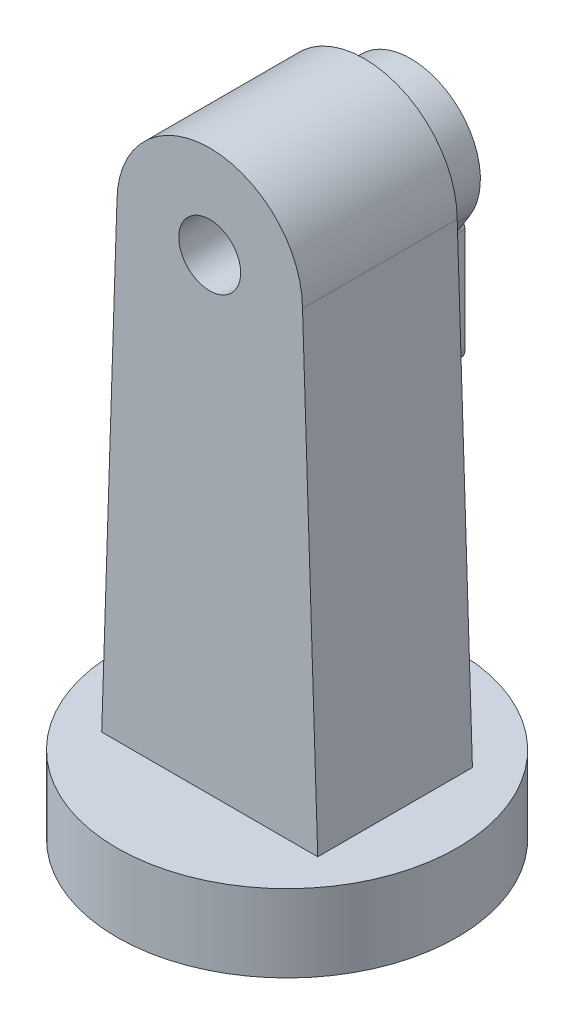
ISO-10303-21;
HEADER;
FILE_DESCRIPTION(('STEP AP214'),'2;1');
FILE_NAME('part.step','',(''),(''),'','','');
FILE_SCHEMA(('AUTOMOTIVE_DESIGN { 1 0 10303 214 1 1 1 1 }'));
ENDSEC;
DATA;
#1=APPLICATION_CONTEXT('core data for automotive mechanical design processes');
#2=APPLICATION_PROTOCOL_DEFINITION('international standard','automotive_design',2000,#1);
#3=PRODUCT_CONTEXT('',#1,'mechanical');
#4=PRODUCT('Part','Part','',(#3));
#5=PRODUCT_RELATED_PRODUCT_CATEGORY('part','',(#4));
#6=PRODUCT_DEFINITION_FORMATION('','',#4);
#7=PRODUCT_DEFINITION_CONTEXT('part definition',#1,'design');
#8=PRODUCT_DEFINITION('design','',#6,#7);
#9=PRODUCT_DEFINITION_SHAPE('','',#8);
#10=(LENGTH_UNIT() NAMED_UNIT(*) SI_UNIT(.MILLI.,.METRE.));
#11=(NAMED_UNIT(*) PLANE_ANGLE_UNIT() SI_UNIT($,.RADIAN.));
#12=(NAMED_UNIT(*) SI_UNIT($,.STERADIAN.) SOLID_ANGLE_UNIT());
#13=UNCERTAINTY_MEASURE_WITH_UNIT(LENGTH_MEASURE(1.E-05),#10,'distance_accuracy_value','');
#14=(GEOMETRIC_REPRESENTATION_CONTEXT(3) GLOBAL_UNCERTAINTY_ASSIGNED_CONTEXT((#13)) GLOBAL_UNIT_ASSIGNED_CONTEXT((#10,
#11,#12)) REPRESENTATION_CONTEXT('',''));
#15=CARTESIAN_POINT('',(0.,0.,0.));
#16=DIRECTION('',(0.,0.,1.));
#17=DIRECTION('',(1.,0.,0.));
#18=AXIS2_PLACEMENT_3D('',#15,#16,#17);
#19=CARTESIAN_POINT('',(0.,352.,-50.));
#20=DIRECTION('',(0.,0.,1.));
#21=DIRECTION('',(1.,0.,0.));
#22=AXIS2_PLACEMENT_3D('',#19,#20,#21);
#23=PLANE('',#22);
#24=CARTESIAN_POINT('',(-90.,200.,-50.));
#25=DIRECTION('',(0.,0.,-1.));
#26=DIRECTION('',(-1.,0.,0.));
#27=AXIS2_PLACEMENT_3D('',#24,#25,#26);
#28=CIRCLE('',#27,40.);
#29=CARTESIAN_POINT('',(-56.1716242251202,178.654251185926,-50.));
#30=VERTEX_POINT('',#29);
#31=CARTESIAN_POINT('',(-65.9933221673163,168.005009463391,-50.));
#32=VERTEX_POINT('',#31);
#33=EDGE_CURVE('E250',#30,#32,#28,.T.);
#34=ORIENTED_EDGE('',*,*,#33,.F.);
#35=DIRECTION('',(-0.53364372035184,-0.845709394371996,0.));
#36=VECTOR('',#35,1.);
#37=CARTESIAN_POINT('',(38.0569227467398,327.986032584167,-50.));
#38=LINE('',#37,#36);
#39=CARTESIAN_POINT('',(38.0569227467398,327.986032584167,-50.));
#40=VERTEX_POINT('',#39);
#41=EDGE_CURVE('E216',#40,#30,#38,.T.);
#42=ORIENTED_EDGE('',*,*,#41,.F.);
#43=CARTESIAN_POINT('',(0.,352.,-50.));
#44=DIRECTION('',(0.,0.,-1.));
#45=DIRECTION('',(-1.,0.,0.));
#46=AXIS2_PLACEMENT_3D('',#43,#44,#45);
#47=CIRCLE('',#46,45.);
#48=CARTESIAN_POINT('',(-39.3548332710316,373.821940752584,-50.));
#49=VERTEX_POINT('',#48);
#50=EDGE_CURVE('E209',#49,#40,#47,.T.);
#51=ORIENTED_EDGE('',*,*,#50,.F.);
#52=DIRECTION('',(0.4849320167241,0.874551850467368,0.));
#53=VECTOR('',#52,1.);
#54=CARTESIAN_POINT('',(-124.982074018695,219.397280668964,-50.));
#55=LINE('',#54,#53);
#56=CARTESIAN_POINT('',(-60.5333037268024,335.627575587166,-50.));
#57=VERTEX_POINT('',#56);
#58=EDGE_CURVE('E253',#57,#49,#55,.T.);
#59=ORIENTED_EDGE('',*,*,#58,.F.);
#60=DIRECTION('',(-0.0325560231980527,-0.999469912180216,0.));
#61=VECTOR('',#60,1.);
#62=CARTESIAN_POINT('',(-60.,352.,-50.));
#63=LINE('',#62,#61);
#64=CARTESIAN_POINT('',(-60.,352.,-50.));
#65=VERTEX_POINT('',#64);
#66=EDGE_CURVE('E290',#65,#57,#63,.T.);
#67=ORIENTED_EDGE('',*,*,#66,.F.);
#68=CARTESIAN_POINT('',(0.,352.,-50.));
#69=DIRECTION('',(0.,0.,1.));
#70=DIRECTION('',(1.,0.,0.));
#71=AXIS2_PLACEMENT_3D('',#68,#69,#70);
#72=CIRCLE('',#71,60.);
#73=CARTESIAN_POINT('',(60.,352.,-50.));
#74=VERTEX_POINT('',#73);
#75=EDGE_CURVE('E278',#74,#65,#72,.T.);
#76=ORIENTED_EDGE('',*,*,#75,.F.);
#77=DIRECTION('',(-0.0325560231980527,0.999469912180216,0.));
#78=VECTOR('',#77,1.);
#79=CARTESIAN_POINT('',(70.,45.,-50.));
#80=LINE('',#79,#78);
#81=CARTESIAN_POINT('',(69.8371335504886,50.,-50.));
#82=VERTEX_POINT('',#81);
#83=EDGE_CURVE('E292',#82,#74,#80,.T.);
#84=ORIENTED_EDGE('',*,*,#83,.F.);
#85=DIRECTION('',(1.,0.,0.));
#86=VECTOR('',#85,1.);
#87=CARTESIAN_POINT('',(0.,50.,-50.));
#88=LINE('',#87,#86);
#89=CARTESIAN_POINT('',(-69.8371335504886,50.,-50.));
#90=VERTEX_POINT('',#89);
#91=EDGE_CURVE('E310',#90,#82,#88,.T.);
#92=ORIENTED_EDGE('',*,*,#91,.F.);
#93=EDGE_CURVE('E295',#32,#90,#63,.T.);
#94=ORIENTED_EDGE('',*,*,#93,.F.);
#95=EDGE_LOOP('',(#34,#42,#51,#59,#67,#76,#84,#92,#94));
#96=FACE_BOUND('',#95,.T.);
#97=ADVANCED_FACE('F47',(#96),#23,.F.);
#98=CARTESIAN_POINT('',(0.,50.,0.));
#99=DIRECTION('',(0.,-1.,0.));
#100=DIRECTION('',(0.,0.,-1.));
#101=AXIS2_PLACEMENT_3D('',#98,#99,#100);
#102=CYLINDRICAL_SURFACE('',#101,110.);
#103=CARTESIAN_POINT('',(0.,50.,0.));
#104=DIRECTION('',(0.,1.,0.));
#105=DIRECTION('',(0.,0.,1.));
#106=AXIS2_PLACEMENT_3D('',#103,#104,#105);
#107=CIRCLE('',#106,110.);
#108=CARTESIAN_POINT('',(0.,50.,110.));
#109=VERTEX_POINT('',#108);
#110=EDGE_CURVE('E303',#109,#109,#107,.T.);
#111=ORIENTED_EDGE('',*,*,#110,.F.);
#112=EDGE_LOOP('',(#111));
#113=FACE_BOUND('',#112,.T.);
#114=CARTESIAN_POINT('',(0.,0.,0.));
#115=DIRECTION('',(0.,1.,0.));
#116=DIRECTION('',(0.,0.,1.));
#117=AXIS2_PLACEMENT_3D('',#114,#115,#116);
#118=CIRCLE('',#117,110.);
#119=CARTESIAN_POINT('',(0.,0.,110.));
#120=VERTEX_POINT('',#119);
#121=EDGE_CURVE('E301',#120,#120,#118,.T.);
#122=ORIENTED_EDGE('',*,*,#121,.T.);
#123=EDGE_LOOP('',(#122));
#124=FACE_BOUND('',#123,.T.);
#125=ADVANCED_FACE('F51',(#113,#124),#102,.T.);
#126=CARTESIAN_POINT('',(0.,50.,0.));
#127=DIRECTION('',(0.,1.,0.));
#128=DIRECTION('',(0.,0.,1.));
#129=AXIS2_PLACEMENT_3D('',#126,#127,#128);
#130=PLANE('',#129);
#131=DIRECTION('',(1.,0.,0.));
#132=VECTOR('',#131,1.);
#133=CARTESIAN_POINT('',(0.,50.,50.));
#134=LINE('',#133,#132);
#135=CARTESIAN_POINT('',(-69.8371335504886,50.,50.));
#136=VERTEX_POINT('',#135);
#137=CARTESIAN_POINT('',(69.8371335504886,50.,50.));
#138=VERTEX_POINT('',#137);
#139=EDGE_CURVE('E56',#136,#138,#134,.T.);
#140=ORIENTED_EDGE('',*,*,#139,.F.);
#141=DIRECTION('',(0.,0.,-1.));
#142=VECTOR('',#141,1.);
#143=CARTESIAN_POINT('',(-69.8371335504886,50.,0.));
#144=LINE('',#143,#142);
#145=EDGE_CURVE('E319',#136,#90,#144,.T.);
#146=ORIENTED_EDGE('',*,*,#145,.T.);
#147=ORIENTED_EDGE('',*,*,#91,.T.);
#148=DIRECTION('',(0.,0.,1.));
#149=VECTOR('',#148,1.);
#150=CARTESIAN_POINT('',(69.8371335504886,50.,0.));
#151=LINE('',#150,#149);
#152=EDGE_CURVE('E316',#82,#138,#151,.T.);
#153=ORIENTED_EDGE('',*,*,#152,.T.);
#154=EDGE_LOOP('',(#140,#146,#147,#153));
#155=FACE_BOUND('',#154,.T.);
#156=ORIENTED_EDGE('',*,*,#110,.T.);
#157=EDGE_LOOP('',(#156));
#158=FACE_BOUND('',#157,.T.);
#159=ADVANCED_FACE('F338',(#155,#158),#130,.T.);
#160=CARTESIAN_POINT('',(0.,0.,0.));
#161=DIRECTION('',(0.,1.,0.));
#162=DIRECTION('',(0.,0.,1.));
#163=AXIS2_PLACEMENT_3D('',#160,#161,#162);
#164=PLANE('',#163);
#165=ORIENTED_EDGE('',*,*,#121,.F.);
#166=EDGE_LOOP('',(#165));
#167=FACE_BOUND('',#166,.T.);
#168=ADVANCED_FACE('F431',(#167),#164,.F.);
#169=CARTESIAN_POINT('',(-60.,352.,50.));
#170=DIRECTION('',(0.999469912180216,-0.0325560231980527,0.));
#171=DIRECTION('',(0.0325560231980527,0.999469912180216,0.));
#172=AXIS2_PLACEMENT_3D('',#169,#170,#171);
#173=PLANE('',#172);
#174=ORIENTED_EDGE('',*,*,#145,.F.);
#175=DIRECTION('',(-0.0325560231980527,-0.999469912180216,0.));
#176=VECTOR('',#175,1.);
#177=CARTESIAN_POINT('',(-60.,352.,50.));
#178=LINE('',#177,#176);
#179=CARTESIAN_POINT('',(-60.,352.,50.));
#180=VERTEX_POINT('',#179);
#181=EDGE_CURVE('E274',#180,#136,#178,.T.);
#182=ORIENTED_EDGE('',*,*,#181,.F.);
#183=DIRECTION('',(0.,0.,-1.));
#184=VECTOR('',#183,1.);
#185=CARTESIAN_POINT('',(-60.,352.,50.));
#186=LINE('',#185,#184);
#187=EDGE_CURVE('E287',#180,#65,#186,.T.);
#188=ORIENTED_EDGE('',*,*,#187,.T.);
#189=ORIENTED_EDGE('',*,*,#66,.T.);
#190=EDGE_CURVE('E269',#57,#32,#63,.T.);
#191=ORIENTED_EDGE('',*,*,#190,.T.);
#192=ORIENTED_EDGE('',*,*,#93,.T.);
#193=EDGE_LOOP('',(#174,#182,#188,#189,#191,#192));
#194=FACE_BOUND('',#193,.T.);
#195=ADVANCED_FACE('F350',(#194),#173,.F.);
#196=CARTESIAN_POINT('',(70.,45.,50.));
#197=DIRECTION('',(-0.999469912180216,-0.0325560231980527,0.));
#198=DIRECTION('',(0.0325560231980527,-0.999469912180216,0.));
#199=AXIS2_PLACEMENT_3D('',#196,#197,#198);
#200=PLANE('',#199);
#201=ORIENTED_EDGE('',*,*,#152,.F.);
#202=ORIENTED_EDGE('',*,*,#83,.T.);
#203=DIRECTION('',(0.,0.,-1.));
#204=VECTOR('',#203,1.);
#205=CARTESIAN_POINT('',(60.,352.,50.));
#206=LINE('',#205,#204);
#207=CARTESIAN_POINT('',(60.,352.,50.));
#208=VERTEX_POINT('',#207);
#209=EDGE_CURVE('E296',#208,#74,#206,.T.);
#210=ORIENTED_EDGE('',*,*,#209,.F.);
#211=DIRECTION('',(-0.0325560231980527,0.999469912180216,0.));
#212=VECTOR('',#211,1.);
#213=CARTESIAN_POINT('',(70.,45.,50.));
#214=LINE('',#213,#212);
#215=EDGE_CURVE('E276',#138,#208,#214,.T.);
#216=ORIENTED_EDGE('',*,*,#215,.F.);
#217=EDGE_LOOP('',(#201,#202,#210,#216));
#218=FACE_BOUND('',#217,.T.);
#219=ADVANCED_FACE('F331',(#218),#200,.F.);
#220=CARTESIAN_POINT('',(0.,352.,50.));
#221=DIRECTION('',(0.,0.,-1.));
#222=DIRECTION('',(-1.,0.,0.));
#223=AXIS2_PLACEMENT_3D('',#220,#221,#222);
#224=CYLINDRICAL_SURFACE('',#223,60.);
#225=ORIENTED_EDGE('',*,*,#75,.T.);
#226=ORIENTED_EDGE('',*,*,#187,.F.);
#227=CARTESIAN_POINT('',(0.,352.,50.));
#228=DIRECTION('',(0.,0.,1.));
#229=DIRECTION('',(1.,0.,0.));
#230=AXIS2_PLACEMENT_3D('',#227,#228,#229);
#231=CIRCLE('',#230,60.);
#232=EDGE_CURVE('E282',#208,#180,#231,.T.);
#233=ORIENTED_EDGE('',*,*,#232,.F.);
#234=ORIENTED_EDGE('',*,*,#209,.T.);
#235=EDGE_LOOP('',(#225,#226,#233,#234));
#236=FACE_BOUND('',#235,.T.);
#237=ADVANCED_FACE('F341',(#236),#224,.T.);
#238=CARTESIAN_POINT('',(0.,352.,50.));
#239=DIRECTION('',(0.,0.,1.));
#240=DIRECTION('',(1.,0.,0.));
#241=AXIS2_PLACEMENT_3D('',#238,#239,#240);
#242=PLANE('',#241);
#243=CARTESIAN_POINT('',(0.,352.,50.));
#244=DIRECTION('',(0.,0.,1.));
#245=DIRECTION('',(1.,0.,0.));
#246=AXIS2_PLACEMENT_3D('',#243,#244,#245);
#247=CIRCLE('',#246,20.);
#248=CARTESIAN_POINT('',(20.,352.,50.));
#249=VERTEX_POINT('',#248);
#250=EDGE_CURVE('E271',#249,#249,#247,.T.);
#251=ORIENTED_EDGE('',*,*,#250,.F.);
#252=EDGE_LOOP('',(#251));
#253=FACE_BOUND('',#252,.T.);
#254=ORIENTED_EDGE('',*,*,#181,.T.);
#255=ORIENTED_EDGE('',*,*,#139,.T.);
#256=ORIENTED_EDGE('',*,*,#215,.T.);
#257=ORIENTED_EDGE('',*,*,#232,.T.);
#258=EDGE_LOOP('',(#254,#255,#256,#257));
#259=FACE_BOUND('',#258,.T.);
#260=ADVANCED_FACE('F327',(#253,#259),#242,.T.);
#261=CARTESIAN_POINT('',(0.,352.,-110.));
#262=DIRECTION('',(0.,0.,1.));
#263=DIRECTION('',(1.,0.,0.));
#264=AXIS2_PLACEMENT_3D('',#261,#262,#263);
#265=CYLINDRICAL_SURFACE('',#264,20.);
#266=ORIENTED_EDGE('',*,*,#250,.T.);
#267=EDGE_LOOP('',(#266));
#268=FACE_BOUND('',#267,.T.);
#269=CARTESIAN_POINT('',(0.,352.,-50.));
#270=DIRECTION('',(0.,0.,1.));
#271=DIRECTION('',(1.,0.,0.));
#272=AXIS2_PLACEMENT_3D('',#269,#270,#271);
#273=CIRCLE('',#272,20.);
#274=CARTESIAN_POINT('',(20.,352.,-50.));
#275=VERTEX_POINT('',#274);
#276=EDGE_CURVE('E52',#275,#275,#273,.T.);
#277=ORIENTED_EDGE('',*,*,#276,.F.);
#278=EDGE_LOOP('',(#277));
#279=FACE_BOUND('',#278,.T.);
#280=ADVANCED_FACE('F415',(#268,#279),#265,.F.);
#281=CARTESIAN_POINT('',(0.,352.,-50.));
#282=DIRECTION('',(0.,0.,-1.));
#283=DIRECTION('',(-1.,0.,0.));
#284=AXIS2_PLACEMENT_3D('',#281,#282,#283);
#285=PLANE('',#284);
#286=ORIENTED_EDGE('',*,*,#276,.T.);
#287=EDGE_LOOP('',(#286));
#288=FACE_BOUND('',#287,.T.);
#289=ADVANCED_FACE('F400',(#288),#285,.F.);
#290=CARTESIAN_POINT('',(0.,352.,-80.));
#291=DIRECTION('',(0.,0.,1.));
#292=DIRECTION('',(1.,0.,0.));
#293=AXIS2_PLACEMENT_3D('',#290,#291,#292);
#294=CYLINDRICAL_SURFACE('',#293,45.);
#295=ORIENTED_EDGE('',*,*,#50,.T.);
#296=DIRECTION('',(0.,0.,1.));
#297=VECTOR('',#296,1.);
#298=CARTESIAN_POINT('',(38.0569227467398,327.986032584167,-80.));
#299=LINE('',#298,#297);
#300=CARTESIAN_POINT('',(38.0569227467398,327.986032584167,-80.));
#301=VERTEX_POINT('',#300);
#302=EDGE_CURVE('E266',#301,#40,#299,.T.);
#303=ORIENTED_EDGE('',*,*,#302,.F.);
#304=CARTESIAN_POINT('',(0.,352.,-80.));
#305=DIRECTION('',(0.,0.,-1.));
#306=DIRECTION('',(-1.,0.,0.));
#307=AXIS2_PLACEMENT_3D('',#304,#305,#306);
#308=CIRCLE('',#307,45.);
#309=CARTESIAN_POINT('',(-39.3548332710316,373.821940752584,-80.));
#310=VERTEX_POINT('',#309);
#311=EDGE_CURVE('E225',#310,#301,#308,.T.);
#312=ORIENTED_EDGE('',*,*,#311,.F.);
#313=DIRECTION('',(0.,0.,1.));
#314=VECTOR('',#313,1.);
#315=CARTESIAN_POINT('',(-39.3548332710316,373.821940752584,-80.));
#316=LINE('',#315,#314);
#317=EDGE_CURVE('E243',#310,#49,#316,.T.);
#318=ORIENTED_EDGE('',*,*,#317,.T.);
#319=EDGE_LOOP('',(#295,#303,#312,#318));
#320=FACE_BOUND('',#319,.T.);
#321=ADVANCED_FACE('F412',(#320),#294,.T.);
#322=CARTESIAN_POINT('',(38.0569227467398,327.986032584167,-80.));
#323=DIRECTION('',(-0.845709394371996,0.53364372035184,0.));
#324=DIRECTION('',(-0.53364372035184,-0.845709394371996,0.));
#325=AXIS2_PLACEMENT_3D('',#322,#323,#324);
#326=PLANE('',#325);
#327=ORIENTED_EDGE('',*,*,#41,.T.);
#328=DIRECTION('',(0.,0.,1.));
#329=VECTOR('',#328,1.);
#330=CARTESIAN_POINT('',(-56.1716242251202,178.654251185926,-80.));
#331=LINE('',#330,#329);
#332=CARTESIAN_POINT('',(-56.1716242251202,178.654251185926,-80.));
#333=VERTEX_POINT('',#332);
#334=EDGE_CURVE('E265',#333,#30,#331,.T.);
#335=ORIENTED_EDGE('',*,*,#334,.F.);
#336=DIRECTION('',(-0.53364372035184,-0.845709394371996,0.));
#337=VECTOR('',#336,1.);
#338=CARTESIAN_POINT('',(38.0569227467398,327.986032584167,-80.));
#339=LINE('',#338,#337);
#340=CARTESIAN_POINT('',(-50.,188.434935164137,-80.));
#341=VERTEX_POINT('',#340);
#342=EDGE_CURVE('E228',#341,#333,#339,.T.);
#343=ORIENTED_EDGE('',*,*,#342,.F.);
#344=EDGE_CURVE('E227',#301,#341,#339,.T.);
#345=ORIENTED_EDGE('',*,*,#344,.F.);
#346=ORIENTED_EDGE('',*,*,#302,.T.);
#347=EDGE_LOOP('',(#327,#335,#343,#345,#346));
#348=FACE_BOUND('',#347,.T.);
#349=ADVANCED_FACE('F480',(#348),#326,.F.);
#350=CARTESIAN_POINT('',(-90.,200.,-80.));
#351=DIRECTION('',(0.,0.,1.));
#352=DIRECTION('',(1.,0.,0.));
#353=AXIS2_PLACEMENT_3D('',#350,#351,#352);
#354=CYLINDRICAL_SURFACE('',#353,40.);
#355=ORIENTED_EDGE('',*,*,#33,.T.);
#356=CARTESIAN_POINT('',(-124.982074018695,219.397280668964,-50.));
#357=VERTEX_POINT('',#356);
#358=EDGE_CURVE('E247',#32,#357,#28,.T.);
#359=ORIENTED_EDGE('',*,*,#358,.T.);
#360=DIRECTION('',(0.,0.,1.));
#361=VECTOR('',#360,1.);
#362=CARTESIAN_POINT('',(-124.982074018695,219.397280668964,-80.));
#363=LINE('',#362,#361);
#364=CARTESIAN_POINT('',(-124.982074018695,219.397280668964,-80.));
#365=VERTEX_POINT('',#364);
#366=EDGE_CURVE('E256',#365,#357,#363,.T.);
#367=ORIENTED_EDGE('',*,*,#366,.F.);
#368=CARTESIAN_POINT('',(-90.,200.,-80.));
#369=DIRECTION('',(0.,0.,-1.));
#370=DIRECTION('',(-1.,0.,0.));
#371=AXIS2_PLACEMENT_3D('',#368,#369,#370);
#372=CIRCLE('',#371,40.);
#373=CARTESIAN_POINT('',(-130.,200.,-80.));
#374=VERTEX_POINT('',#373);
#375=EDGE_CURVE('E232',#374,#365,#372,.T.);
#376=ORIENTED_EDGE('',*,*,#375,.F.);
#377=CARTESIAN_POINT('',(-90.,160.,-80.));
#378=VERTEX_POINT('',#377);
#379=EDGE_CURVE('E240',#378,#374,#372,.T.);
#380=ORIENTED_EDGE('',*,*,#379,.F.);
#381=EDGE_CURVE('E235',#333,#378,#372,.T.);
#382=ORIENTED_EDGE('',*,*,#381,.F.);
#383=ORIENTED_EDGE('',*,*,#334,.T.);
#384=EDGE_LOOP('',(#355,#359,#367,#376,#380,#382,#383));
#385=FACE_BOUND('',#384,.T.);
#386=ADVANCED_FACE('F387',(#385),#354,.T.);
#387=CARTESIAN_POINT('',(-124.982074018695,219.397280668964,-80.));
#388=DIRECTION('',(0.874551850467368,-0.4849320167241,0.));
#389=DIRECTION('',(0.4849320167241,0.874551850467368,0.));
#390=AXIS2_PLACEMENT_3D('',#387,#388,#389);
#391=PLANE('',#390);
#392=EDGE_CURVE('E229',#357,#57,#55,.T.);
#393=ORIENTED_EDGE('',*,*,#392,.T.);
#394=ORIENTED_EDGE('',*,*,#58,.T.);
#395=ORIENTED_EDGE('',*,*,#317,.F.);
#396=DIRECTION('',(0.4849320167241,0.874551850467368,0.));
#397=VECTOR('',#396,1.);
#398=CARTESIAN_POINT('',(-124.982074018695,219.397280668964,-80.));
#399=LINE('',#398,#397);
#400=CARTESIAN_POINT('',(-113.558030687404,240.,-80.));
#401=VERTEX_POINT('',#400);
#402=EDGE_CURVE('E237',#401,#310,#399,.T.);
#403=ORIENTED_EDGE('',*,*,#402,.F.);
#404=EDGE_CURVE('E236',#365,#401,#399,.T.);
#405=ORIENTED_EDGE('',*,*,#404,.F.);
#406=ORIENTED_EDGE('',*,*,#366,.T.);
#407=EDGE_LOOP('',(#393,#394,#395,#403,#405,#406));
#408=FACE_BOUND('',#407,.T.);
#409=ADVANCED_FACE('F393',(#408),#391,.F.);
#410=CARTESIAN_POINT('',(0.,352.,-80.));
#411=DIRECTION('',(0.,0.,-1.));
#412=DIRECTION('',(-1.,0.,0.));
#413=AXIS2_PLACEMENT_3D('',#410,#411,#412);
#414=PLANE('',#413);
#415=DIRECTION('',(0.,-1.,0.));
#416=VECTOR('',#415,1.);
#417=CARTESIAN_POINT('',(-50.,166.,-80.));
#418=LINE('',#417,#416);
#419=CARTESIAN_POINT('',(-50.,234.,-80.));
#420=VERTEX_POINT('',#419);
#421=EDGE_CURVE('E69',#420,#341,#418,.T.);
#422=ORIENTED_EDGE('',*,*,#421,.F.);
#423=CARTESIAN_POINT('',(-56.,234.,-80.));
#424=DIRECTION('',(0.,0.,-1.));
#425=DIRECTION('',(1.,0.,0.));
#426=AXIS2_PLACEMENT_3D('',#423,#424,#425);
#427=CIRCLE('',#426,6.00000000000001);
#428=CARTESIAN_POINT('',(-56.,240.,-80.));
#429=VERTEX_POINT('',#428);
#430=EDGE_CURVE('E684',#429,#420,#427,.T.);
#431=ORIENTED_EDGE('',*,*,#430,.F.);
#432=DIRECTION('',(1.,0.,0.));
#433=VECTOR('',#432,1.);
#434=CARTESIAN_POINT('',(-56.,240.,-80.));
#435=LINE('',#434,#433);
#436=EDGE_CURVE('E11',#401,#429,#435,.T.);
#437=ORIENTED_EDGE('',*,*,#436,.F.);
#438=ORIENTED_EDGE('',*,*,#402,.T.);
#439=ORIENTED_EDGE('',*,*,#311,.T.);
#440=ORIENTED_EDGE('',*,*,#344,.T.);
#441=EDGE_LOOP('',(#422,#431,#437,#438,#439,#440));
#442=FACE_BOUND('',#441,.T.);
#443=ADVANCED_FACE('F391',(#442),#414,.T.);
#444=ORIENTED_EDGE('',*,*,#190,.F.);
#445=ORIENTED_EDGE('',*,*,#392,.F.);
#446=ORIENTED_EDGE('',*,*,#358,.F.);
#447=EDGE_LOOP('',(#444,#445,#446));
#448=FACE_BOUND('',#447,.T.);
#449=ADVANCED_FACE('F394',(#448),#285,.F.);
#450=CARTESIAN_POINT('',(-56.,166.,-80.));
#451=DIRECTION('',(0.,0.,1.));
#452=DIRECTION('',(1.,0.,0.));
#453=AXIS2_PLACEMENT_3D('',#450,#451,#452);
#454=PLANE('',#453);
#455=CARTESIAN_POINT('',(-50.,166.,-80.));
#456=VERTEX_POINT('',#455);
#457=EDGE_CURVE('E681',#341,#456,#418,.T.);
#458=ORIENTED_EDGE('',*,*,#457,.F.);
#459=ORIENTED_EDGE('',*,*,#342,.T.);
#460=ORIENTED_EDGE('',*,*,#381,.T.);
#461=DIRECTION('',(-1.,0.,0.));
#462=VECTOR('',#461,1.);
#463=CARTESIAN_POINT('',(-56.,160.,-80.));
#464=LINE('',#463,#462);
#465=CARTESIAN_POINT('',(-56.,160.,-80.));
#466=VERTEX_POINT('',#465);
#467=EDGE_CURVE('E741',#466,#378,#464,.T.);
#468=ORIENTED_EDGE('',*,*,#467,.F.);
#469=CARTESIAN_POINT('',(-56.,166.,-80.));
#470=DIRECTION('',(0.,0.,-1.));
#471=DIRECTION('',(1.,0.,0.));
#472=AXIS2_PLACEMENT_3D('',#469,#470,#471);
#473=CIRCLE('',#472,6.);
#474=EDGE_CURVE('E208',#456,#466,#473,.T.);
#475=ORIENTED_EDGE('',*,*,#474,.F.);
#476=EDGE_LOOP('',(#458,#459,#460,#468,#475));
#477=FACE_BOUND('',#476,.T.);
#478=ADVANCED_FACE('F395',(#477),#454,.T.);
#479=CARTESIAN_POINT('',(-124.,160.,-80.));
#480=VERTEX_POINT('',#479);
#481=EDGE_CURVE('E748',#378,#480,#464,.T.);
#482=ORIENTED_EDGE('',*,*,#481,.F.);
#483=ORIENTED_EDGE('',*,*,#379,.T.);
#484=DIRECTION('',(0.,1.,0.));
#485=VECTOR('',#484,1.);
#486=CARTESIAN_POINT('',(-130.,166.,-80.));
#487=LINE('',#486,#485);
#488=CARTESIAN_POINT('',(-130.,166.,-80.));
#489=VERTEX_POINT('',#488);
#490=EDGE_CURVE('E663',#489,#374,#487,.T.);
#491=ORIENTED_EDGE('',*,*,#490,.F.);
#492=CARTESIAN_POINT('',(-124.,166.,-80.));
#493=DIRECTION('',(0.,0.,-1.));
#494=DIRECTION('',(-1.,0.,0.));
#495=AXIS2_PLACEMENT_3D('',#492,#493,#494);
#496=CIRCLE('',#495,6.00000000000001);
#497=EDGE_CURVE('E668',#480,#489,#496,.T.);
#498=ORIENTED_EDGE('',*,*,#497,.F.);
#499=EDGE_LOOP('',(#482,#483,#491,#498));
#500=FACE_BOUND('',#499,.T.);
#501=ADVANCED_FACE('F404',(#500),#454,.T.);
#502=CARTESIAN_POINT('',(-56.,166.,-165.));
#503=DIRECTION('',(0.,0.,1.));
#504=DIRECTION('',(1.,0.,0.));
#505=AXIS2_PLACEMENT_3D('',#502,#503,#504);
#506=CYLINDRICAL_SURFACE('',#505,6.);
#507=ORIENTED_EDGE('',*,*,#474,.T.);
#508=DIRECTION('',(0.,0.,1.));
#509=VECTOR('',#508,1.);
#510=CARTESIAN_POINT('',(-56.,160.,-165.));
#511=LINE('',#510,#509);
#512=CARTESIAN_POINT('',(-56.,160.,-165.));
#513=VERTEX_POINT('',#512);
#514=EDGE_CURVE('E189',#513,#466,#511,.T.);
#515=ORIENTED_EDGE('',*,*,#514,.F.);
#516=CARTESIAN_POINT('',(-56.,166.,-165.));
#517=DIRECTION('',(0.,0.,-1.));
#518=DIRECTION('',(1.,0.,0.));
#519=AXIS2_PLACEMENT_3D('',#516,#517,#518);
#520=CIRCLE('',#519,6.);
#521=CARTESIAN_POINT('',(-50.,166.,-165.));
#522=VERTEX_POINT('',#521);
#523=EDGE_CURVE('E193',#522,#513,#520,.T.);
#524=ORIENTED_EDGE('',*,*,#523,.F.);
#525=DIRECTION('',(0.,0.,1.));
#526=VECTOR('',#525,1.);
#527=CARTESIAN_POINT('',(-50.,166.,-165.));
#528=LINE('',#527,#526);
#529=EDGE_CURVE('E689',#522,#456,#528,.T.);
#530=ORIENTED_EDGE('',*,*,#529,.T.);
#531=EDGE_LOOP('',(#507,#515,#524,#530));
#532=FACE_BOUND('',#531,.T.);
#533=ADVANCED_FACE('F206',(#532),#506,.T.);
#534=CARTESIAN_POINT('',(-56.,160.,-165.));
#535=DIRECTION('',(0.,1.,0.));
#536=DIRECTION('',(0.,0.,1.));
#537=AXIS2_PLACEMENT_3D('',#534,#535,#536);
#538=PLANE('',#537);
#539=ORIENTED_EDGE('',*,*,#467,.T.);
#540=ORIENTED_EDGE('',*,*,#481,.T.);
#541=DIRECTION('',(0.,0.,1.));
#542=VECTOR('',#541,1.);
#543=CARTESIAN_POINT('',(-124.,160.,-165.));
#544=LINE('',#543,#542);
#545=CARTESIAN_POINT('',(-124.,160.,-165.));
#546=VERTEX_POINT('',#545);
#547=EDGE_CURVE('E186',#546,#480,#544,.T.);
#548=ORIENTED_EDGE('',*,*,#547,.F.);
#549=DIRECTION('',(-1.,0.,0.));
#550=VECTOR('',#549,1.);
#551=CARTESIAN_POINT('',(-56.,160.,-165.));
#552=LINE('',#551,#550);
#553=EDGE_CURVE('E185',#513,#546,#552,.T.);
#554=ORIENTED_EDGE('',*,*,#553,.F.);
#555=ORIENTED_EDGE('',*,*,#514,.T.);
#556=EDGE_LOOP('',(#539,#540,#548,#554,#555));
#557=FACE_BOUND('',#556,.T.);
#558=ADVANCED_FACE('F183',(#557),#538,.F.);
#559=CARTESIAN_POINT('',(-124.,166.,-165.));
#560=DIRECTION('',(0.,0.,1.));
#561=DIRECTION('',(1.,0.,0.));
#562=AXIS2_PLACEMENT_3D('',#559,#560,#561);
#563=CYLINDRICAL_SURFACE('',#562,6.00000000000001);
#564=ORIENTED_EDGE('',*,*,#497,.T.);
#565=DIRECTION('',(0.,0.,1.));
#566=VECTOR('',#565,1.);
#567=CARTESIAN_POINT('',(-130.,166.,-165.));
#568=LINE('',#567,#566);
#569=CARTESIAN_POINT('',(-130.,166.,-165.));
#570=VERTEX_POINT('',#569);
#571=EDGE_CURVE('E217',#570,#489,#568,.T.);
#572=ORIENTED_EDGE('',*,*,#571,.F.);
#573=CARTESIAN_POINT('',(-124.,166.,-165.));
#574=DIRECTION('',(0.,0.,-1.));
#575=DIRECTION('',(-1.,0.,0.));
#576=AXIS2_PLACEMENT_3D('',#573,#574,#575);
#577=CIRCLE('',#576,6.00000000000001);
#578=EDGE_CURVE('E191',#546,#570,#577,.T.);
#579=ORIENTED_EDGE('',*,*,#578,.F.);
#580=ORIENTED_EDGE('',*,*,#547,.T.);
#581=EDGE_LOOP('',(#564,#572,#579,#580));
#582=FACE_BOUND('',#581,.T.);
#583=ADVANCED_FACE('F530',(#582),#563,.T.);
#584=CARTESIAN_POINT('',(-130.,166.,-165.));
#585=DIRECTION('',(1.,0.,0.));
#586=DIRECTION('',(0.,0.,-1.));
#587=AXIS2_PLACEMENT_3D('',#584,#585,#586);
#588=PLANE('',#587);
#589=ORIENTED_EDGE('',*,*,#490,.T.);
#590=CARTESIAN_POINT('',(-130.,234.,-80.));
#591=VERTEX_POINT('',#590);
#592=EDGE_CURVE('E657',#374,#591,#487,.T.);
#593=ORIENTED_EDGE('',*,*,#592,.T.);
#594=DIRECTION('',(0.,0.,1.));
#595=VECTOR('',#594,1.);
#596=CARTESIAN_POINT('',(-130.,234.,-165.));
#597=LINE('',#596,#595);
#598=CARTESIAN_POINT('',(-130.,234.,-165.));
#599=VERTEX_POINT('',#598);
#600=EDGE_CURVE('E703',#599,#591,#597,.T.);
#601=ORIENTED_EDGE('',*,*,#600,.F.);
#602=DIRECTION('',(0.,1.,0.));
#603=VECTOR('',#602,1.);
#604=CARTESIAN_POINT('',(-130.,166.,-165.));
#605=LINE('',#604,#603);
#606=EDGE_CURVE('E729',#570,#599,#605,.T.);
#607=ORIENTED_EDGE('',*,*,#606,.F.);
#608=ORIENTED_EDGE('',*,*,#571,.T.);
#609=EDGE_LOOP('',(#589,#593,#601,#607,#608));
#610=FACE_BOUND('',#609,.T.);
#611=ADVANCED_FACE('F538',(#610),#588,.F.);
#612=CARTESIAN_POINT('',(-124.,234.,-165.));
#613=DIRECTION('',(0.,0.,1.));
#614=DIRECTION('',(1.,0.,0.));
#615=AXIS2_PLACEMENT_3D('',#612,#613,#614);
#616=CYLINDRICAL_SURFACE('',#615,6.00000000000001);
#617=CARTESIAN_POINT('',(-124.,234.,-80.));
#618=DIRECTION('',(0.,0.,-1.));
#619=DIRECTION('',(1.,0.,0.));
#620=AXIS2_PLACEMENT_3D('',#617,#618,#619);
#621=CIRCLE('',#620,6.00000000000001);
#622=CARTESIAN_POINT('',(-124.,240.,-80.));
#623=VERTEX_POINT('',#622);
#624=EDGE_CURVE('E662',#591,#623,#621,.T.);
#625=ORIENTED_EDGE('',*,*,#624,.T.);
#626=DIRECTION('',(0.,0.,1.));
#627=VECTOR('',#626,1.);
#628=CARTESIAN_POINT('',(-124.,240.,-165.));
#629=LINE('',#628,#627);
#630=CARTESIAN_POINT('',(-124.,240.,-165.));
#631=VERTEX_POINT('',#630);
#632=EDGE_CURVE('E699',#631,#623,#629,.T.);
#633=ORIENTED_EDGE('',*,*,#632,.F.);
#634=CARTESIAN_POINT('',(-124.,234.,-165.));
#635=DIRECTION('',(0.,0.,-1.));
#636=DIRECTION('',(1.,0.,0.));
#637=AXIS2_PLACEMENT_3D('',#634,#635,#636);
#638=CIRCLE('',#637,6.00000000000001);
#639=EDGE_CURVE('E725',#599,#631,#638,.T.);
#640=ORIENTED_EDGE('',*,*,#639,.F.);
#641=ORIENTED_EDGE('',*,*,#600,.T.);
#642=EDGE_LOOP('',(#625,#633,#640,#641));
#643=FACE_BOUND('',#642,.T.);
#644=ADVANCED_FACE('F547',(#643),#616,.T.);
#645=CARTESIAN_POINT('',(-56.,240.,-165.));
#646=DIRECTION('',(0.,-1.,0.));
#647=DIRECTION('',(0.,0.,-1.));
#648=AXIS2_PLACEMENT_3D('',#645,#646,#647);
#649=PLANE('',#648);
#650=EDGE_CURVE('E63',#623,#401,#435,.T.);
#651=ORIENTED_EDGE('',*,*,#650,.T.);
#652=ORIENTED_EDGE('',*,*,#436,.T.);
#653=DIRECTION('',(0.,0.,1.));
#654=VECTOR('',#653,1.);
#655=CARTESIAN_POINT('',(-56.,240.,-165.));
#656=LINE('',#655,#654);
#657=CARTESIAN_POINT('',(-56.,240.,-165.));
#658=VERTEX_POINT('',#657);
#659=EDGE_CURVE('E694',#658,#429,#656,.T.);
#660=ORIENTED_EDGE('',*,*,#659,.F.);
#661=DIRECTION('',(1.,0.,0.));
#662=VECTOR('',#661,1.);
#663=CARTESIAN_POINT('',(-56.,240.,-165.));
#664=LINE('',#663,#662);
#665=EDGE_CURVE('E718',#631,#658,#664,.T.);
#666=ORIENTED_EDGE('',*,*,#665,.F.);
#667=ORIENTED_EDGE('',*,*,#632,.T.);
#668=EDGE_LOOP('',(#651,#652,#660,#666,#667));
#669=FACE_BOUND('',#668,.T.);
#670=ADVANCED_FACE('F557',(#669),#649,.F.);
#671=CARTESIAN_POINT('',(-56.,234.,-165.));
#672=DIRECTION('',(0.,0.,1.));
#673=DIRECTION('',(1.,0.,0.));
#674=AXIS2_PLACEMENT_3D('',#671,#672,#673);
#675=CYLINDRICAL_SURFACE('',#674,6.00000000000001);
#676=ORIENTED_EDGE('',*,*,#430,.T.);
#677=DIRECTION('',(0.,0.,1.));
#678=VECTOR('',#677,1.);
#679=CARTESIAN_POINT('',(-50.,234.,-165.));
#680=LINE('',#679,#678);
#681=CARTESIAN_POINT('',(-50.,234.,-165.));
#682=VERTEX_POINT('',#681);
#683=EDGE_CURVE('E693',#682,#420,#680,.T.);
#684=ORIENTED_EDGE('',*,*,#683,.F.);
#685=CARTESIAN_POINT('',(-56.,234.,-165.));
#686=DIRECTION('',(0.,0.,-1.));
#687=DIRECTION('',(1.,0.,0.));
#688=AXIS2_PLACEMENT_3D('',#685,#686,#687);
#689=CIRCLE('',#688,6.00000000000001);
#690=EDGE_CURVE('E717',#658,#682,#689,.T.);
#691=ORIENTED_EDGE('',*,*,#690,.F.);
#692=ORIENTED_EDGE('',*,*,#659,.T.);
#693=EDGE_LOOP('',(#676,#684,#691,#692));
#694=FACE_BOUND('',#693,.T.);
#695=ADVANCED_FACE('F566',(#694),#675,.T.);
#696=CARTESIAN_POINT('',(-50.,166.,-165.));
#697=DIRECTION('',(-1.,0.,0.));
#698=DIRECTION('',(0.,0.,1.));
#699=AXIS2_PLACEMENT_3D('',#696,#697,#698);
#700=PLANE('',#699);
#701=ORIENTED_EDGE('',*,*,#421,.T.);
#702=ORIENTED_EDGE('',*,*,#457,.T.);
#703=ORIENTED_EDGE('',*,*,#529,.F.);
#704=DIRECTION('',(0.,-1.,0.));
#705=VECTOR('',#704,1.);
#706=CARTESIAN_POINT('',(-50.,166.,-165.));
#707=LINE('',#706,#705);
#708=EDGE_CURVE('E199',#682,#522,#707,.T.);
#709=ORIENTED_EDGE('',*,*,#708,.F.);
#710=ORIENTED_EDGE('',*,*,#683,.T.);
#711=EDGE_LOOP('',(#701,#702,#703,#709,#710));
#712=FACE_BOUND('',#711,.T.);
#713=ADVANCED_FACE('F579',(#712),#700,.F.);
#714=CARTESIAN_POINT('',(-56.,166.,-165.));
#715=DIRECTION('',(0.,0.,1.));
#716=DIRECTION('',(1.,0.,0.));
#717=AXIS2_PLACEMENT_3D('',#714,#715,#716);
#718=PLANE('',#717);
#719=ORIENTED_EDGE('',*,*,#523,.T.);
#720=ORIENTED_EDGE('',*,*,#553,.T.);
#721=ORIENTED_EDGE('',*,*,#578,.T.);
#722=ORIENTED_EDGE('',*,*,#606,.T.);
#723=ORIENTED_EDGE('',*,*,#639,.T.);
#724=ORIENTED_EDGE('',*,*,#665,.T.);
#725=ORIENTED_EDGE('',*,*,#690,.T.);
#726=ORIENTED_EDGE('',*,*,#708,.T.);
#727=EDGE_LOOP('',(#719,#720,#721,#722,#723,#724,#725,#726));
#728=FACE_BOUND('',#727,.T.);
#729=ADVANCED_FACE('F196',(#728),#718,.F.);
#730=ORIENTED_EDGE('',*,*,#592,.F.);
#731=ORIENTED_EDGE('',*,*,#375,.T.);
#732=ORIENTED_EDGE('',*,*,#404,.T.);
#733=ORIENTED_EDGE('',*,*,#650,.F.);
#734=ORIENTED_EDGE('',*,*,#624,.F.);
#735=EDGE_LOOP('',(#730,#731,#732,#733,#734));
#736=FACE_BOUND('',#735,.T.);
#737=ADVANCED_FACE('F409',(#736),#454,.T.);
#738=CLOSED_SHELL('',(#97,#125,#159,#168,#195,#219,#237,#260,#280,#289,#321,#349,#386,#409,#443,
#449,#478,#501,#533,#558,#583,#611,#644,#670,#695,#713,#729,#737));
#739=MANIFOLD_SOLID_BREP('B2',#738);
#740=ADVANCED_BREP_SHAPE_REPRESENTATION('',(#18,#739),#14);
#741=SHAPE_DEFINITION_REPRESENTATION(#9,#740);
ENDSEC;
END-ISO-10303-21;
